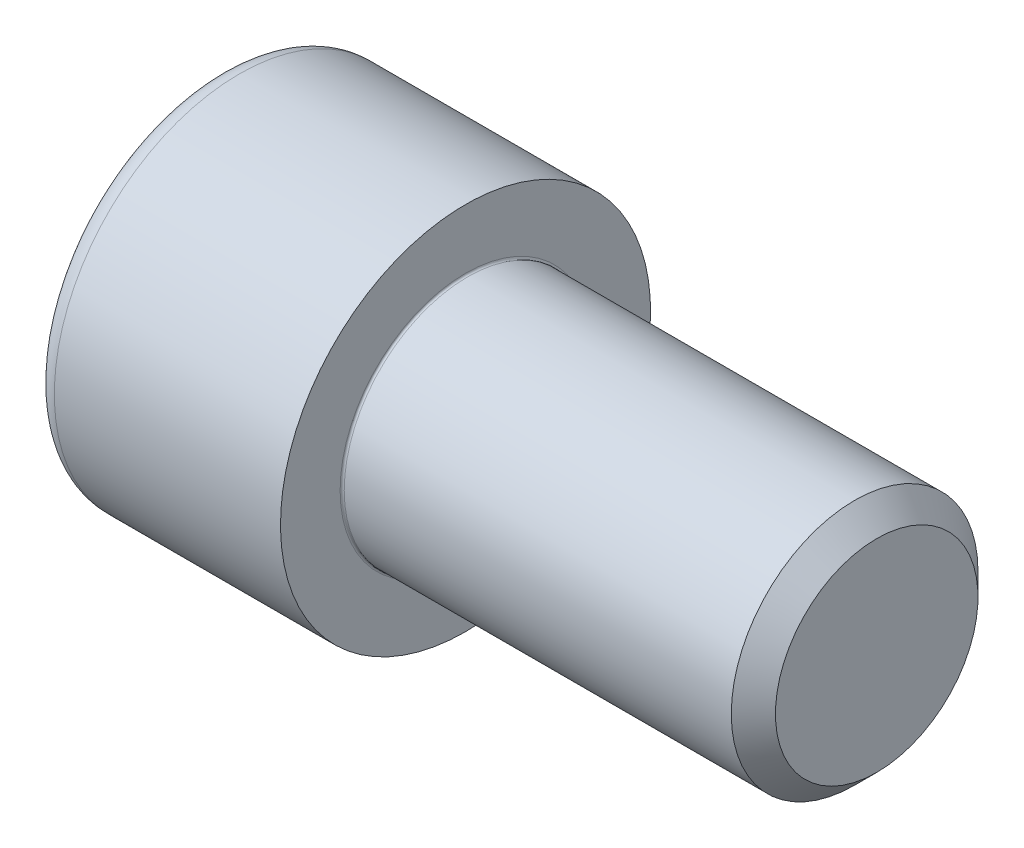
ISO-10303-21;
HEADER;
FILE_DESCRIPTION(('STEP AP214'),'2;1');
FILE_NAME('part.step','',(''),(''),'','','');
FILE_SCHEMA(('AUTOMOTIVE_DESIGN { 1 0 10303 214 1 1 1 1 }'));
ENDSEC;
DATA;
#1=APPLICATION_CONTEXT('core data for automotive mechanical design processes');
#2=APPLICATION_PROTOCOL_DEFINITION('international standard','automotive_design',2000,#1);
#3=PRODUCT_CONTEXT('',#1,'mechanical');
#4=PRODUCT('Part','Part','',(#3));
#5=PRODUCT_RELATED_PRODUCT_CATEGORY('part','',(#4));
#6=PRODUCT_DEFINITION_FORMATION('','',#4);
#7=PRODUCT_DEFINITION_CONTEXT('part definition',#1,'design');
#8=PRODUCT_DEFINITION('design','',#6,#7);
#9=PRODUCT_DEFINITION_SHAPE('','',#8);
#10=(LENGTH_UNIT() NAMED_UNIT(*) SI_UNIT(.MILLI.,.METRE.));
#11=(NAMED_UNIT(*) PLANE_ANGLE_UNIT() SI_UNIT($,.RADIAN.));
#12=(NAMED_UNIT(*) SI_UNIT($,.STERADIAN.) SOLID_ANGLE_UNIT());
#13=UNCERTAINTY_MEASURE_WITH_UNIT(LENGTH_MEASURE(1.E-05),#10,'distance_accuracy_value','');
#14=(GEOMETRIC_REPRESENTATION_CONTEXT(3) GLOBAL_UNCERTAINTY_ASSIGNED_CONTEXT((#13)) GLOBAL_UNIT_ASSIGNED_CONTEXT((#10,
#11,#12)) REPRESENTATION_CONTEXT('',''));
#15=CARTESIAN_POINT('',(0.,0.,0.));
#16=DIRECTION('',(0.,0.,1.));
#17=DIRECTION('',(1.,0.,0.));
#18=AXIS2_PLACEMENT_3D('',#15,#16,#17);
#19=CARTESIAN_POINT('',(20.,0.,0.));
#20=DIRECTION('',(-1.,0.,0.));
#21=DIRECTION('',(0.,-1.,0.));
#22=AXIS2_PLACEMENT_3D('',#19,#20,#21);
#23=PLANE('',#22);
#24=CARTESIAN_POINT('',(20.,0.,0.));
#25=DIRECTION('',(-1.,0.,0.));
#26=DIRECTION('',(0.,-1.,0.));
#27=AXIS2_PLACEMENT_3D('',#24,#25,#26);
#28=CIRCLE('',#27,4.9264625);
#29=CARTESIAN_POINT('',(20.,-4.9264625,0.));
#30=VERTEX_POINT('',#29);
#31=EDGE_CURVE('E63',#30,#30,#28,.F.);
#32=ORIENTED_EDGE('',*,*,#31,.T.);
#33=EDGE_LOOP('',(#32));
#34=FACE_BOUND('',#33,.T.);
#35=ADVANCED_FACE('F52',(#34),#23,.F.);
#36=CARTESIAN_POINT('',(-2.06666666666666,0.,0.));
#37=DIRECTION('',(-1.,0.,0.));
#38=DIRECTION('',(0.,-1.,0.));
#39=AXIS2_PLACEMENT_3D('',#36,#37,#38);
#40=CYLINDRICAL_SURFACE('',#39,6.);
#41=CARTESIAN_POINT('',(0.100000000000002,0.,0.));
#42=DIRECTION('',(-1.,0.,0.));
#43=DIRECTION('',(0.,-1.,0.));
#44=AXIS2_PLACEMENT_3D('',#41,#42,#43);
#45=CIRCLE('',#44,6.);
#46=CARTESIAN_POINT('',(0.100000000000002,-6.,0.));
#47=VERTEX_POINT('',#46);
#48=EDGE_CURVE('E11',#47,#47,#45,.F.);
#49=ORIENTED_EDGE('',*,*,#48,.T.);
#50=EDGE_LOOP('',(#49));
#51=FACE_BOUND('',#50,.T.);
#52=CARTESIAN_POINT('',(18.9264625,0.,0.));
#53=DIRECTION('',(-1.,0.,0.));
#54=DIRECTION('',(0.,-1.,0.));
#55=AXIS2_PLACEMENT_3D('',#52,#53,#54);
#56=CIRCLE('',#55,6.);
#57=CARTESIAN_POINT('',(18.9264625,-6.,0.));
#58=VERTEX_POINT('',#57);
#59=EDGE_CURVE('E67',#58,#58,#56,.T.);
#60=ORIENTED_EDGE('',*,*,#59,.T.);
#61=EDGE_LOOP('',(#60));
#62=FACE_BOUND('',#61,.T.);
#63=ADVANCED_FACE('F86',(#51,#62),#40,.T.);
#64=CARTESIAN_POINT('',(0.,6.,0.));
#65=DIRECTION('',(-1.,0.,0.));
#66=DIRECTION('',(0.,-1.,0.));
#67=AXIS2_PLACEMENT_3D('',#64,#65,#66);
#68=PLANE('',#67);
#69=CARTESIAN_POINT('',(0.,0.,0.));
#70=DIRECTION('',(-1.,0.,0.));
#71=DIRECTION('',(0.,-1.,0.));
#72=AXIS2_PLACEMENT_3D('',#69,#70,#71);
#73=CIRCLE('',#72,6.1);
#74=CARTESIAN_POINT('',(0.,-6.1,0.));
#75=VERTEX_POINT('',#74);
#76=EDGE_CURVE('E59',#75,#75,#73,.T.);
#77=ORIENTED_EDGE('',*,*,#76,.T.);
#78=EDGE_LOOP('',(#77));
#79=FACE_BOUND('',#78,.T.);
#80=CARTESIAN_POINT('',(0.,0.,0.));
#81=DIRECTION('',(-1.,0.,0.));
#82=DIRECTION('',(0.,-1.,0.));
#83=AXIS2_PLACEMENT_3D('',#80,#81,#82);
#84=CIRCLE('',#83,9.);
#85=CARTESIAN_POINT('',(0.,-9.,0.));
#86=VERTEX_POINT('',#85);
#87=EDGE_CURVE('E78',#86,#86,#84,.T.);
#88=ORIENTED_EDGE('',*,*,#87,.F.);
#89=EDGE_LOOP('',(#88));
#90=FACE_BOUND('',#89,.T.);
#91=ADVANCED_FACE('F84',(#79,#90),#68,.F.);
#92=CARTESIAN_POINT('',(-2.06666666666666,0.,0.));
#93=DIRECTION('',(-1.,0.,0.));
#94=DIRECTION('',(0.,-1.,0.));
#95=AXIS2_PLACEMENT_3D('',#92,#93,#94);
#96=CYLINDRICAL_SURFACE('',#95,9.);
#97=CARTESIAN_POINT('',(-11.,0.,0.));
#98=DIRECTION('',(1.,0.,0.));
#99=DIRECTION('',(0.,1.,0.));
#100=AXIS2_PLACEMENT_3D('',#97,#98,#99);
#101=CIRCLE('',#100,9.);
#102=CARTESIAN_POINT('',(-11.,9.,0.));
#103=VERTEX_POINT('',#102);
#104=EDGE_CURVE('E72',#103,#103,#101,.T.);
#105=ORIENTED_EDGE('',*,*,#104,.T.);
#106=EDGE_LOOP('',(#105));
#107=FACE_BOUND('',#106,.T.);
#108=ORIENTED_EDGE('',*,*,#87,.T.);
#109=EDGE_LOOP('',(#108));
#110=FACE_BOUND('',#109,.T.);
#111=ADVANCED_FACE('F82',(#107,#110),#96,.T.);
#112=CARTESIAN_POINT('',(-12.,9.,0.));
#113=DIRECTION('',(1.,0.,0.));
#114=DIRECTION('',(0.,1.,0.));
#115=AXIS2_PLACEMENT_3D('',#112,#113,#114);
#116=PLANE('',#115);
#117=CARTESIAN_POINT('',(-12.,0.,0.));
#118=DIRECTION('',(1.,0.,0.));
#119=DIRECTION('',(0.,1.,0.));
#120=AXIS2_PLACEMENT_3D('',#117,#118,#119);
#121=CIRCLE('',#120,8.);
#122=CARTESIAN_POINT('',(-12.,8.,0.));
#123=VERTEX_POINT('',#122);
#124=EDGE_CURVE('E75',#123,#123,#121,.F.);
#125=ORIENTED_EDGE('',*,*,#124,.T.);
#126=EDGE_LOOP('',(#125));
#127=FACE_BOUND('',#126,.T.);
#128=ADVANCED_FACE('F92',(#127),#116,.F.);
#129=CARTESIAN_POINT('',(-11.,0.,0.));
#130=DIRECTION('',(1.,0.,0.));
#131=DIRECTION('',(0.,1.,0.));
#132=AXIS2_PLACEMENT_3D('',#129,#130,#131);
#133=TOROIDAL_SURFACE('',#132,8.,1.);
#134=ORIENTED_EDGE('',*,*,#104,.F.);
#135=EDGE_LOOP('',(#134));
#136=FACE_BOUND('',#135,.T.);
#137=ORIENTED_EDGE('',*,*,#124,.F.);
#138=EDGE_LOOP('',(#137));
#139=FACE_BOUND('',#138,.T.);
#140=ADVANCED_FACE('F102',(#136,#139),#133,.T.);
#141=CARTESIAN_POINT('',(18.9264625,0.,0.));
#142=DIRECTION('',(-1.,0.,0.));
#143=DIRECTION('',(0.,-1.,0.));
#144=AXIS2_PLACEMENT_3D('',#141,#142,#143);
#145=CONICAL_SURFACE('',#144,6.,0.78539816339745);
#146=ORIENTED_EDGE('',*,*,#31,.F.);
#147=EDGE_LOOP('',(#146));
#148=FACE_BOUND('',#147,.T.);
#149=ORIENTED_EDGE('',*,*,#59,.F.);
#150=EDGE_LOOP('',(#149));
#151=FACE_BOUND('',#150,.T.);
#152=ADVANCED_FACE('F104',(#148,#151),#145,.T.);
#153=CARTESIAN_POINT('',(0.100000000000002,0.,0.));
#154=DIRECTION('',(-1.,0.,0.));
#155=DIRECTION('',(0.,-1.,0.));
#156=AXIS2_PLACEMENT_3D('',#153,#154,#155);
#157=TOROIDAL_SURFACE('',#156,6.1,0.1);
#158=ORIENTED_EDGE('',*,*,#48,.F.);
#159=EDGE_LOOP('',(#158));
#160=FACE_BOUND('',#159,.T.);
#161=ORIENTED_EDGE('',*,*,#76,.F.);
#162=EDGE_LOOP('',(#161));
#163=FACE_BOUND('',#162,.T.);
#164=ADVANCED_FACE('F54',(#160,#163),#157,.F.);
#165=CLOSED_SHELL('',(#35,#63,#91,#111,#128,#140,#152,#164));
#166=MANIFOLD_SOLID_BREP('B2',#165);
#167=ADVANCED_BREP_SHAPE_REPRESENTATION('',(#18,#166),#14);
#168=SHAPE_DEFINITION_REPRESENTATION(#9,#167);
ENDSEC;
END-ISO-10303-21;
